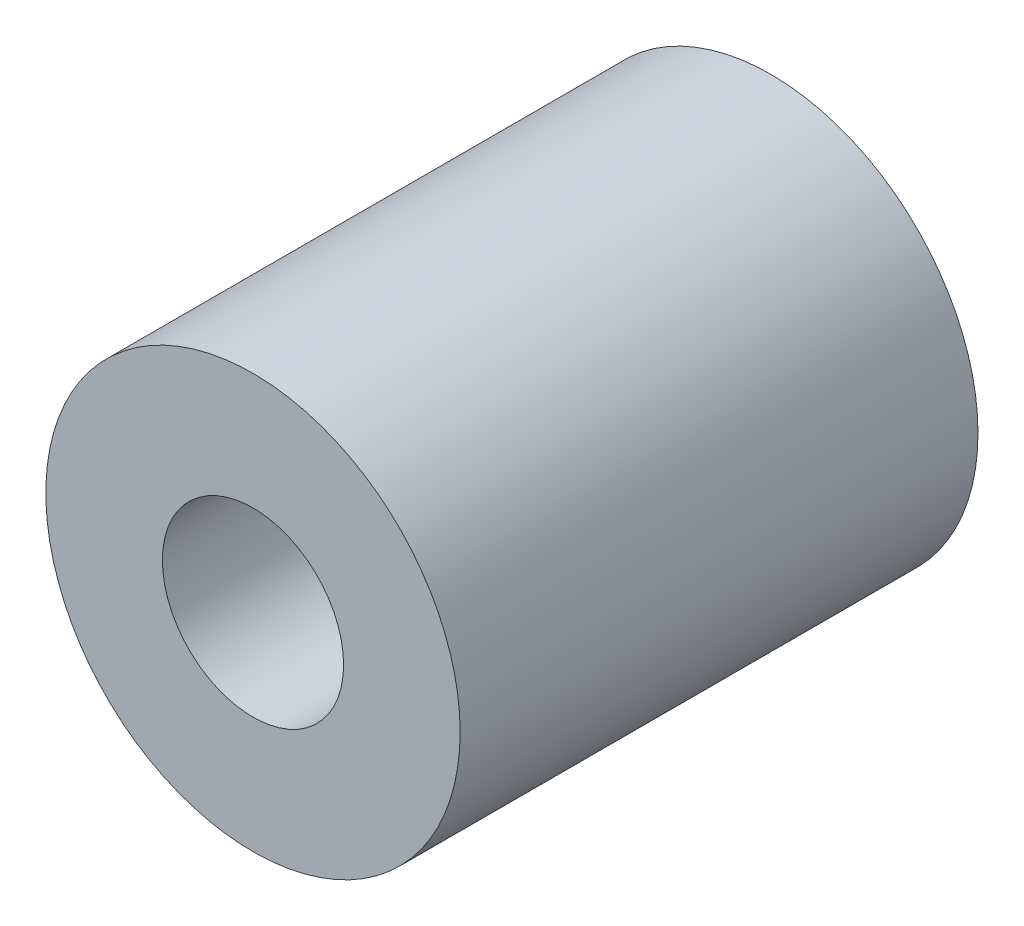
ISO-10303-21;
HEADER;
FILE_DESCRIPTION(('STEP AP214'),'2;1');
FILE_NAME('part.step','',(''),(''),'','','');
FILE_SCHEMA(('AUTOMOTIVE_DESIGN { 1 0 10303 214 1 1 1 1 }'));
ENDSEC;
DATA;
#1=APPLICATION_CONTEXT('core data for automotive mechanical design processes');
#2=APPLICATION_PROTOCOL_DEFINITION('international standard','automotive_design',2000,#1);
#3=PRODUCT_CONTEXT('',#1,'mechanical');
#4=PRODUCT('Part','Part','',(#3));
#5=PRODUCT_RELATED_PRODUCT_CATEGORY('part','',(#4));
#6=PRODUCT_DEFINITION_FORMATION('','',#4);
#7=PRODUCT_DEFINITION_CONTEXT('part definition',#1,'design');
#8=PRODUCT_DEFINITION('design','',#6,#7);
#9=PRODUCT_DEFINITION_SHAPE('','',#8);
#10=(LENGTH_UNIT() NAMED_UNIT(*) SI_UNIT(.MILLI.,.METRE.));
#11=(NAMED_UNIT(*) PLANE_ANGLE_UNIT() SI_UNIT($,.RADIAN.));
#12=(NAMED_UNIT(*) SI_UNIT($,.STERADIAN.) SOLID_ANGLE_UNIT());
#13=UNCERTAINTY_MEASURE_WITH_UNIT(LENGTH_MEASURE(1.E-05),#10,'distance_accuracy_value','');
#14=(GEOMETRIC_REPRESENTATION_CONTEXT(3) GLOBAL_UNCERTAINTY_ASSIGNED_CONTEXT((#13)) GLOBAL_UNIT_ASSIGNED_CONTEXT((#10,
#11,#12)) REPRESENTATION_CONTEXT('',''));
#15=CARTESIAN_POINT('',(0.,0.,0.));
#16=DIRECTION('',(0.,0.,1.));
#17=DIRECTION('',(1.,0.,0.));
#18=AXIS2_PLACEMENT_3D('',#15,#16,#17);
#19=CARTESIAN_POINT('',(0.,0.,10.));
#20=DIRECTION('',(0.,0.,1.));
#21=DIRECTION('',(1.,0.,0.));
#22=AXIS2_PLACEMENT_3D('',#19,#20,#21);
#23=PLANE('',#22);
#24=CARTESIAN_POINT('',(0.,0.,10.));
#25=DIRECTION('',(0.,0.,1.));
#26=DIRECTION('',(1.,0.,0.));
#27=AXIS2_PLACEMENT_3D('',#24,#25,#26);
#28=CIRCLE('',#27,4.);
#29=CARTESIAN_POINT('',(4.,0.,10.));
#30=VERTEX_POINT('',#29);
#31=EDGE_CURVE('E10',#30,#30,#28,.T.);
#32=ORIENTED_EDGE('',*,*,#31,.T.);
#33=EDGE_LOOP('',(#32));
#34=FACE_BOUND('',#33,.T.);
#35=CARTESIAN_POINT('',(0.,0.,10.));
#36=DIRECTION('',(0.,0.,1.));
#37=DIRECTION('',(1.,0.,0.));
#38=AXIS2_PLACEMENT_3D('',#35,#36,#37);
#39=CIRCLE('',#38,1.75);
#40=CARTESIAN_POINT('',(1.75,0.,10.));
#41=VERTEX_POINT('',#40);
#42=EDGE_CURVE('E50',#41,#41,#39,.T.);
#43=ORIENTED_EDGE('',*,*,#42,.F.);
#44=EDGE_LOOP('',(#43));
#45=FACE_BOUND('',#44,.T.);
#46=ADVANCED_FACE('F37',(#34,#45),#23,.T.);
#47=CARTESIAN_POINT('',(0.,0.,0.));
#48=DIRECTION('',(0.,0.,1.));
#49=DIRECTION('',(1.,0.,0.));
#50=AXIS2_PLACEMENT_3D('',#47,#48,#49);
#51=PLANE('',#50);
#52=CARTESIAN_POINT('',(0.,0.,0.));
#53=DIRECTION('',(0.,0.,1.));
#54=DIRECTION('',(1.,0.,0.));
#55=AXIS2_PLACEMENT_3D('',#52,#53,#54);
#56=CIRCLE('',#55,4.);
#57=CARTESIAN_POINT('',(4.,0.,0.));
#58=VERTEX_POINT('',#57);
#59=EDGE_CURVE('E41',#58,#58,#56,.T.);
#60=ORIENTED_EDGE('',*,*,#59,.F.);
#61=EDGE_LOOP('',(#60));
#62=FACE_BOUND('',#61,.T.);
#63=CARTESIAN_POINT('',(0.,0.,0.));
#64=DIRECTION('',(0.,0.,1.));
#65=DIRECTION('',(1.,0.,0.));
#66=AXIS2_PLACEMENT_3D('',#63,#64,#65);
#67=CIRCLE('',#66,1.75);
#68=CARTESIAN_POINT('',(1.75,0.,0.));
#69=VERTEX_POINT('',#68);
#70=EDGE_CURVE('E52',#69,#69,#67,.T.);
#71=ORIENTED_EDGE('',*,*,#70,.T.);
#72=EDGE_LOOP('',(#71));
#73=FACE_BOUND('',#72,.T.);
#74=ADVANCED_FACE('F64',(#62,#73),#51,.F.);
#75=CARTESIAN_POINT('',(0.,0.,10.));
#76=DIRECTION('',(0.,0.,-1.));
#77=DIRECTION('',(-1.,0.,0.));
#78=AXIS2_PLACEMENT_3D('',#75,#76,#77);
#79=CYLINDRICAL_SURFACE('',#78,4.);
#80=ORIENTED_EDGE('',*,*,#31,.F.);
#81=EDGE_LOOP('',(#80));
#82=FACE_BOUND('',#81,.T.);
#83=ORIENTED_EDGE('',*,*,#59,.T.);
#84=EDGE_LOOP('',(#83));
#85=FACE_BOUND('',#84,.T.);
#86=ADVANCED_FACE('F39',(#82,#85),#79,.T.);
#87=CARTESIAN_POINT('',(0.,0.,10.));
#88=DIRECTION('',(0.,0.,-1.));
#89=DIRECTION('',(-1.,0.,0.));
#90=AXIS2_PLACEMENT_3D('',#87,#88,#89);
#91=CYLINDRICAL_SURFACE('',#90,1.75);
#92=ORIENTED_EDGE('',*,*,#42,.T.);
#93=EDGE_LOOP('',(#92));
#94=FACE_BOUND('',#93,.T.);
#95=ORIENTED_EDGE('',*,*,#70,.F.);
#96=EDGE_LOOP('',(#95));
#97=FACE_BOUND('',#96,.T.);
#98=ADVANCED_FACE('F60',(#94,#97),#91,.F.);
#99=CLOSED_SHELL('',(#46,#74,#86,#98));
#100=MANIFOLD_SOLID_BREP('B2',#99);
#101=ADVANCED_BREP_SHAPE_REPRESENTATION('',(#18,#100),#14);
#102=SHAPE_DEFINITION_REPRESENTATION(#9,#101);
ENDSEC;
END-ISO-10303-21;
